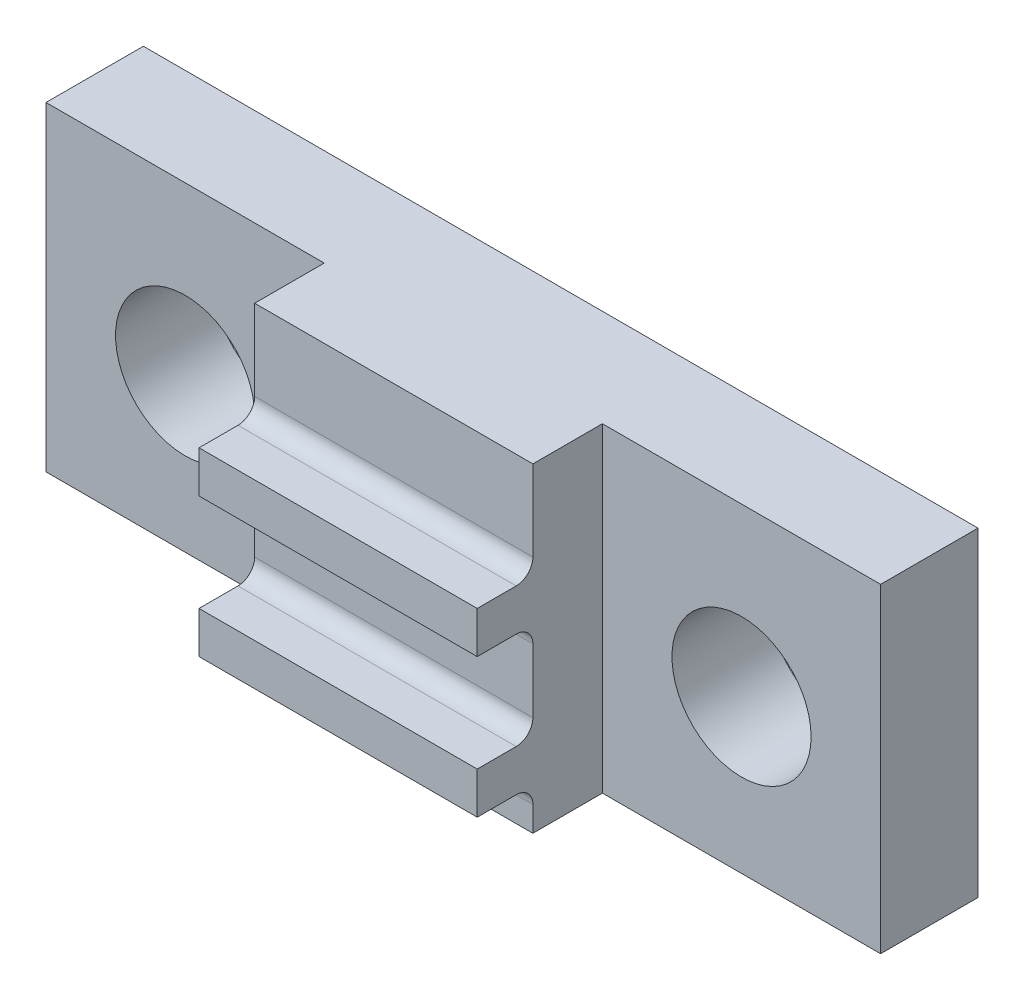
ISO-10303-21;
HEADER;
FILE_DESCRIPTION(('STEP AP214'),'2;1');
FILE_NAME('part.step','',(''),(''),'','','');
FILE_SCHEMA(('AUTOMOTIVE_DESIGN { 1 0 10303 214 1 1 1 1 }'));
ENDSEC;
DATA;
#1=APPLICATION_CONTEXT('core data for automotive mechanical design processes');
#2=APPLICATION_PROTOCOL_DEFINITION('international standard','automotive_design',2000,#1);
#3=PRODUCT_CONTEXT('',#1,'mechanical');
#4=PRODUCT('Part','Part','',(#3));
#5=PRODUCT_RELATED_PRODUCT_CATEGORY('part','',(#4));
#6=PRODUCT_DEFINITION_FORMATION('','',#4);
#7=PRODUCT_DEFINITION_CONTEXT('part definition',#1,'design');
#8=PRODUCT_DEFINITION('design','',#6,#7);
#9=PRODUCT_DEFINITION_SHAPE('','',#8);
#10=(LENGTH_UNIT() NAMED_UNIT(*) SI_UNIT(.MILLI.,.METRE.));
#11=(NAMED_UNIT(*) PLANE_ANGLE_UNIT() SI_UNIT($,.RADIAN.));
#12=(NAMED_UNIT(*) SI_UNIT($,.STERADIAN.) SOLID_ANGLE_UNIT());
#13=UNCERTAINTY_MEASURE_WITH_UNIT(LENGTH_MEASURE(1.E-05),#10,'distance_accuracy_value','');
#14=(GEOMETRIC_REPRESENTATION_CONTEXT(3) GLOBAL_UNCERTAINTY_ASSIGNED_CONTEXT((#13)) GLOBAL_UNIT_ASSIGNED_CONTEXT((#10,
#11,#12)) REPRESENTATION_CONTEXT('',''));
#15=CARTESIAN_POINT('',(0.,0.,0.));
#16=DIRECTION('',(0.,0.,1.));
#17=DIRECTION('',(1.,0.,0.));
#18=AXIS2_PLACEMENT_3D('',#15,#16,#17);
#19=CARTESIAN_POINT('',(0.,0.,8.));
#20=DIRECTION('',(0.,0.,1.));
#21=DIRECTION('',(1.,0.,0.));
#22=AXIS2_PLACEMENT_3D('',#19,#20,#21);
#23=PLANE('',#22);
#24=DIRECTION('',(-1.,0.,0.));
#25=VECTOR('',#24,1.);
#26=CARTESIAN_POINT('',(9.03112887414928,-4.25,8.));
#27=LINE('',#26,#25);
#28=CARTESIAN_POINT('',(5.,-4.25,8.));
#29=VERTEX_POINT('',#28);
#30=CARTESIAN_POINT('',(-5.,-4.25,8.));
#31=VERTEX_POINT('',#30);
#32=EDGE_CURVE('E174',#29,#31,#27,.T.);
#33=ORIENTED_EDGE('',*,*,#32,.F.);
#34=DIRECTION('',(0.,1.,0.));
#35=VECTOR('',#34,1.);
#36=CARTESIAN_POINT('',(5.,5.75,8.));
#37=LINE('',#36,#35);
#38=CARTESIAN_POINT('',(5.,-2.75,8.));
#39=VERTEX_POINT('',#38);
#40=EDGE_CURVE('E186',#29,#39,#37,.T.);
#41=ORIENTED_EDGE('',*,*,#40,.T.);
#42=DIRECTION('',(-1.,0.,0.));
#43=VECTOR('',#42,1.);
#44=CARTESIAN_POINT('',(9.03112887414928,-2.75,8.));
#45=LINE('',#44,#43);
#46=CARTESIAN_POINT('',(-5.,-2.75,8.));
#47=VERTEX_POINT('',#46);
#48=EDGE_CURVE('E274',#39,#47,#45,.T.);
#49=ORIENTED_EDGE('',*,*,#48,.T.);
#50=DIRECTION('',(0.,-1.,0.));
#51=VECTOR('',#50,1.);
#52=CARTESIAN_POINT('',(-5.,5.75,8.));
#53=LINE('',#52,#51);
#54=EDGE_CURVE('E189',#47,#31,#53,.T.);
#55=ORIENTED_EDGE('',*,*,#54,.T.);
#56=EDGE_LOOP('',(#33,#41,#49,#55));
#57=FACE_BOUND('',#56,.T.);
#58=ADVANCED_FACE('F35',(#57),#23,.T.);
#59=CARTESIAN_POINT('',(0.,0.,3.5));
#60=DIRECTION('',(0.,0.,1.));
#61=DIRECTION('',(1.,0.,0.));
#62=AXIS2_PLACEMENT_3D('',#59,#60,#61);
#63=PLANE('',#62);
#64=DIRECTION('',(0.,1.,0.));
#65=VECTOR('',#64,1.);
#66=CARTESIAN_POINT('',(5.,5.75,3.5));
#67=LINE('',#66,#65);
#68=CARTESIAN_POINT('',(5.,-5.75,3.5));
#69=VERTEX_POINT('',#68);
#70=CARTESIAN_POINT('',(5.,5.75,3.5));
#71=VERTEX_POINT('',#70);
#72=EDGE_CURVE('E213',#69,#71,#67,.T.);
#73=ORIENTED_EDGE('',*,*,#72,.F.);
#74=DIRECTION('',(1.,0.,0.));
#75=VECTOR('',#74,1.);
#76=CARTESIAN_POINT('',(-15.,-5.75,3.5));
#77=LINE('',#76,#75);
#78=CARTESIAN_POINT('',(15.,-5.75,3.5));
#79=VERTEX_POINT('',#78);
#80=EDGE_CURVE('E345',#69,#79,#77,.T.);
#81=ORIENTED_EDGE('',*,*,#80,.T.);
#82=DIRECTION('',(0.,1.,0.));
#83=VECTOR('',#82,1.);
#84=CARTESIAN_POINT('',(15.,5.75,3.5));
#85=LINE('',#84,#83);
#86=CARTESIAN_POINT('',(15.,5.75,3.5));
#87=VERTEX_POINT('',#86);
#88=EDGE_CURVE('E341',#79,#87,#85,.T.);
#89=ORIENTED_EDGE('',*,*,#88,.T.);
#90=DIRECTION('',(-1.,0.,0.));
#91=VECTOR('',#90,1.);
#92=CARTESIAN_POINT('',(-15.,5.75,3.5));
#93=LINE('',#92,#91);
#94=EDGE_CURVE('E331',#87,#71,#93,.T.);
#95=ORIENTED_EDGE('',*,*,#94,.T.);
#96=EDGE_LOOP('',(#73,#81,#89,#95));
#97=FACE_BOUND('',#96,.T.);
#98=CARTESIAN_POINT('',(10.,-0.250000000000001,3.5));
#99=DIRECTION('',(0.,0.,1.));
#100=DIRECTION('',(1.,0.,0.));
#101=AXIS2_PLACEMENT_3D('',#98,#99,#100);
#102=CIRCLE('',#101,2.5);
#103=CARTESIAN_POINT('',(12.5,-0.250000000000001,3.5));
#104=VERTEX_POINT('',#103);
#105=EDGE_CURVE('E397',#104,#104,#102,.T.);
#106=ORIENTED_EDGE('',*,*,#105,.F.);
#107=EDGE_LOOP('',(#106));
#108=FACE_BOUND('',#107,.T.);
#109=ADVANCED_FACE('F367',(#97,#108),#63,.T.);
#110=DIRECTION('',(0.,-1.,0.));
#111=VECTOR('',#110,1.);
#112=CARTESIAN_POINT('',(-5.,5.75,3.5));
#113=LINE('',#112,#111);
#114=CARTESIAN_POINT('',(-5.,5.75,3.5));
#115=VERTEX_POINT('',#114);
#116=CARTESIAN_POINT('',(-5.,-5.75,3.5));
#117=VERTEX_POINT('',#116);
#118=EDGE_CURVE('E201',#115,#117,#113,.T.);
#119=ORIENTED_EDGE('',*,*,#118,.F.);
#120=CARTESIAN_POINT('',(-15.,5.75,3.5));
#121=VERTEX_POINT('',#120);
#122=EDGE_CURVE('E336',#115,#121,#93,.T.);
#123=ORIENTED_EDGE('',*,*,#122,.T.);
#124=DIRECTION('',(0.,-1.,0.));
#125=VECTOR('',#124,1.);
#126=CARTESIAN_POINT('',(-15.,5.75,3.5));
#127=LINE('',#126,#125);
#128=CARTESIAN_POINT('',(-15.,-5.75,3.5));
#129=VERTEX_POINT('',#128);
#130=EDGE_CURVE('E335',#121,#129,#127,.T.);
#131=ORIENTED_EDGE('',*,*,#130,.T.);
#132=EDGE_CURVE('E353',#129,#117,#77,.T.);
#133=ORIENTED_EDGE('',*,*,#132,.T.);
#134=EDGE_LOOP('',(#119,#123,#131,#133));
#135=FACE_BOUND('',#134,.T.);
#136=CARTESIAN_POINT('',(-10.,-0.25,3.5));
#137=DIRECTION('',(0.,0.,1.));
#138=DIRECTION('',(1.,0.,0.));
#139=AXIS2_PLACEMENT_3D('',#136,#137,#138);
#140=CIRCLE('',#139,2.5);
#141=CARTESIAN_POINT('',(-7.5,-0.25,3.5));
#142=VERTEX_POINT('',#141);
#143=EDGE_CURVE('E390',#142,#142,#140,.T.);
#144=ORIENTED_EDGE('',*,*,#143,.F.);
#145=EDGE_LOOP('',(#144));
#146=FACE_BOUND('',#145,.T.);
#147=ADVANCED_FACE('F407',(#135,#146),#63,.T.);
#148=CARTESIAN_POINT('',(0.,0.,0.));
#149=DIRECTION('',(0.,0.,1.));
#150=DIRECTION('',(1.,0.,0.));
#151=AXIS2_PLACEMENT_3D('',#148,#149,#150);
#152=PLANE('',#151);
#153=CARTESIAN_POINT('',(-10.,-0.25,0.));
#154=DIRECTION('',(0.,0.,1.));
#155=DIRECTION('',(1.,0.,0.));
#156=AXIS2_PLACEMENT_3D('',#153,#154,#155);
#157=CIRCLE('',#156,2.5);
#158=CARTESIAN_POINT('',(-7.5,-0.25,0.));
#159=VERTEX_POINT('',#158);
#160=EDGE_CURVE('E392',#159,#159,#157,.T.);
#161=ORIENTED_EDGE('',*,*,#160,.T.);
#162=EDGE_LOOP('',(#161));
#163=FACE_BOUND('',#162,.T.);
#164=DIRECTION('',(0.,1.,0.));
#165=VECTOR('',#164,1.);
#166=CARTESIAN_POINT('',(15.,5.75,0.));
#167=LINE('',#166,#165);
#168=CARTESIAN_POINT('',(15.,-5.75,0.));
#169=VERTEX_POINT('',#168);
#170=CARTESIAN_POINT('',(15.,5.75,0.));
#171=VERTEX_POINT('',#170);
#172=EDGE_CURVE('E348',#169,#171,#167,.T.);
#173=ORIENTED_EDGE('',*,*,#172,.F.);
#174=DIRECTION('',(1.,0.,0.));
#175=VECTOR('',#174,1.);
#176=CARTESIAN_POINT('',(-15.,-5.75,0.));
#177=LINE('',#176,#175);
#178=CARTESIAN_POINT('',(-15.,-5.75,0.));
#179=VERTEX_POINT('',#178);
#180=EDGE_CURVE('E375',#179,#169,#177,.T.);
#181=ORIENTED_EDGE('',*,*,#180,.F.);
#182=DIRECTION('',(0.,-1.,0.));
#183=VECTOR('',#182,1.);
#184=CARTESIAN_POINT('',(-15.,5.75,0.));
#185=LINE('',#184,#183);
#186=CARTESIAN_POINT('',(-15.,5.75,0.));
#187=VERTEX_POINT('',#186);
#188=EDGE_CURVE('E379',#187,#179,#185,.T.);
#189=ORIENTED_EDGE('',*,*,#188,.F.);
#190=DIRECTION('',(-1.,0.,0.));
#191=VECTOR('',#190,1.);
#192=CARTESIAN_POINT('',(-15.,5.75,0.));
#193=LINE('',#192,#191);
#194=EDGE_CURVE('E381',#171,#187,#193,.T.);
#195=ORIENTED_EDGE('',*,*,#194,.F.);
#196=EDGE_LOOP('',(#173,#181,#189,#195));
#197=FACE_BOUND('',#196,.T.);
#198=CARTESIAN_POINT('',(10.,-0.250000000000001,0.));
#199=DIRECTION('',(0.,0.,1.));
#200=DIRECTION('',(1.,0.,0.));
#201=AXIS2_PLACEMENT_3D('',#198,#199,#200);
#202=CIRCLE('',#201,2.5);
#203=CARTESIAN_POINT('',(12.5,-0.250000000000001,0.));
#204=VERTEX_POINT('',#203);
#205=EDGE_CURVE('E399',#204,#204,#202,.T.);
#206=ORIENTED_EDGE('',*,*,#205,.T.);
#207=EDGE_LOOP('',(#206));
#208=FACE_BOUND('',#207,.T.);
#209=ADVANCED_FACE('F388',(#163,#197,#208),#152,.F.);
#210=CARTESIAN_POINT('',(15.,5.75,3.5));
#211=DIRECTION('',(-1.,0.,0.));
#212=DIRECTION('',(0.,-1.,0.));
#213=AXIS2_PLACEMENT_3D('',#210,#211,#212);
#214=PLANE('',#213);
#215=ORIENTED_EDGE('',*,*,#172,.T.);
#216=DIRECTION('',(0.,0.,-1.));
#217=VECTOR('',#216,1.);
#218=CARTESIAN_POINT('',(15.,5.75,3.5));
#219=LINE('',#218,#217);
#220=EDGE_CURVE('E319',#87,#171,#219,.T.);
#221=ORIENTED_EDGE('',*,*,#220,.F.);
#222=ORIENTED_EDGE('',*,*,#88,.F.);
#223=DIRECTION('',(0.,0.,-1.));
#224=VECTOR('',#223,1.);
#225=CARTESIAN_POINT('',(15.,-5.75,3.5));
#226=LINE('',#225,#224);
#227=EDGE_CURVE('E355',#79,#169,#226,.T.);
#228=ORIENTED_EDGE('',*,*,#227,.T.);
#229=EDGE_LOOP('',(#215,#221,#222,#228));
#230=FACE_BOUND('',#229,.T.);
#231=ADVANCED_FACE('F378',(#230),#214,.F.);
#232=CARTESIAN_POINT('',(-15.,5.75,3.5));
#233=DIRECTION('',(0.,-1.,0.));
#234=DIRECTION('',(0.,0.,-1.));
#235=AXIS2_PLACEMENT_3D('',#232,#233,#234);
#236=PLANE('',#235);
#237=DIRECTION('',(0.,0.,-1.));
#238=VECTOR('',#237,1.);
#239=CARTESIAN_POINT('',(-5.,5.75,8.));
#240=LINE('',#239,#238);
#241=CARTESIAN_POINT('',(-5.,5.75,6.));
#242=VERTEX_POINT('',#241);
#243=EDGE_CURVE('E617',#242,#115,#240,.T.);
#244=ORIENTED_EDGE('',*,*,#243,.F.);
#245=DIRECTION('',(-1.,0.,0.));
#246=VECTOR('',#245,1.);
#247=CARTESIAN_POINT('',(15.000025,5.75,6.));
#248=LINE('',#247,#246);
#249=CARTESIAN_POINT('',(5.,5.75,6.));
#250=VERTEX_POINT('',#249);
#251=EDGE_CURVE('E304',#250,#242,#248,.T.);
#252=ORIENTED_EDGE('',*,*,#251,.F.);
#253=DIRECTION('',(0.,0.,-1.));
#254=VECTOR('',#253,1.);
#255=CARTESIAN_POINT('',(5.,5.75,8.));
#256=LINE('',#255,#254);
#257=EDGE_CURVE('E309',#250,#71,#256,.T.);
#258=ORIENTED_EDGE('',*,*,#257,.T.);
#259=ORIENTED_EDGE('',*,*,#94,.F.);
#260=ORIENTED_EDGE('',*,*,#220,.T.);
#261=ORIENTED_EDGE('',*,*,#194,.T.);
#262=DIRECTION('',(0.,0.,-1.));
#263=VECTOR('',#262,1.);
#264=CARTESIAN_POINT('',(-15.,5.75,3.5));
#265=LINE('',#264,#263);
#266=EDGE_CURVE('E321',#121,#187,#265,.T.);
#267=ORIENTED_EDGE('',*,*,#266,.F.);
#268=ORIENTED_EDGE('',*,*,#122,.F.);
#269=EDGE_LOOP('',(#244,#252,#258,#259,#260,#261,#267,#268));
#270=FACE_BOUND('',#269,.T.);
#271=ADVANCED_FACE('F426',(#270),#236,.F.);
#272=CARTESIAN_POINT('',(-15.,5.75,3.5));
#273=DIRECTION('',(1.,0.,0.));
#274=DIRECTION('',(0.,1.,0.));
#275=AXIS2_PLACEMENT_3D('',#272,#273,#274);
#276=PLANE('',#275);
#277=ORIENTED_EDGE('',*,*,#188,.T.);
#278=DIRECTION('',(0.,0.,-1.));
#279=VECTOR('',#278,1.);
#280=CARTESIAN_POINT('',(-15.,-5.75,3.5));
#281=LINE('',#280,#279);
#282=EDGE_CURVE('E327',#129,#179,#281,.T.);
#283=ORIENTED_EDGE('',*,*,#282,.F.);
#284=ORIENTED_EDGE('',*,*,#130,.F.);
#285=ORIENTED_EDGE('',*,*,#266,.T.);
#286=EDGE_LOOP('',(#277,#283,#284,#285));
#287=FACE_BOUND('',#286,.T.);
#288=ADVANCED_FACE('F423',(#287),#276,.F.);
#289=CARTESIAN_POINT('',(-15.,-5.75,3.5));
#290=DIRECTION('',(0.,1.,0.));
#291=DIRECTION('',(0.,0.,1.));
#292=AXIS2_PLACEMENT_3D('',#289,#290,#291);
#293=PLANE('',#292);
#294=DIRECTION('',(0.,0.,-1.));
#295=VECTOR('',#294,1.);
#296=CARTESIAN_POINT('',(5.,-5.75,8.));
#297=LINE('',#296,#295);
#298=CARTESIAN_POINT('',(5.,-5.75,6.));
#299=VERTEX_POINT('',#298);
#300=EDGE_CURVE('E207',#299,#69,#297,.T.);
#301=ORIENTED_EDGE('',*,*,#300,.F.);
#302=DIRECTION('',(-1.,0.,0.));
#303=VECTOR('',#302,1.);
#304=CARTESIAN_POINT('',(-15.,-5.75,6.));
#305=LINE('',#304,#303);
#306=CARTESIAN_POINT('',(-5.,-5.75,6.));
#307=VERTEX_POINT('',#306);
#308=EDGE_CURVE('E288',#299,#307,#305,.T.);
#309=ORIENTED_EDGE('',*,*,#308,.T.);
#310=DIRECTION('',(0.,0.,-1.));
#311=VECTOR('',#310,1.);
#312=CARTESIAN_POINT('',(-5.,-5.75,8.));
#313=LINE('',#312,#311);
#314=EDGE_CURVE('E226',#307,#117,#313,.T.);
#315=ORIENTED_EDGE('',*,*,#314,.T.);
#316=ORIENTED_EDGE('',*,*,#132,.F.);
#317=ORIENTED_EDGE('',*,*,#282,.T.);
#318=ORIENTED_EDGE('',*,*,#180,.T.);
#319=ORIENTED_EDGE('',*,*,#227,.F.);
#320=ORIENTED_EDGE('',*,*,#80,.F.);
#321=EDGE_LOOP('',(#301,#309,#315,#316,#317,#318,#319,#320));
#322=FACE_BOUND('',#321,.T.);
#323=ADVANCED_FACE('F372',(#322),#293,.F.);
#324=CARTESIAN_POINT('',(-10.,-0.25,3.5));
#325=DIRECTION('',(0.,0.,-1.));
#326=DIRECTION('',(-1.,0.,0.));
#327=AXIS2_PLACEMENT_3D('',#324,#325,#326);
#328=CYLINDRICAL_SURFACE('',#327,2.5);
#329=ORIENTED_EDGE('',*,*,#143,.T.);
#330=EDGE_LOOP('',(#329));
#331=FACE_BOUND('',#330,.T.);
#332=ORIENTED_EDGE('',*,*,#160,.F.);
#333=EDGE_LOOP('',(#332));
#334=FACE_BOUND('',#333,.T.);
#335=ADVANCED_FACE('F416',(#331,#334),#328,.F.);
#336=CARTESIAN_POINT('',(10.,-0.250000000000001,3.5));
#337=DIRECTION('',(0.,0.,-1.));
#338=DIRECTION('',(-1.,0.,0.));
#339=AXIS2_PLACEMENT_3D('',#336,#337,#338);
#340=CYLINDRICAL_SURFACE('',#339,2.5);
#341=ORIENTED_EDGE('',*,*,#105,.T.);
#342=EDGE_LOOP('',(#341));
#343=FACE_BOUND('',#342,.T.);
#344=ORIENTED_EDGE('',*,*,#205,.F.);
#345=EDGE_LOOP('',(#344));
#346=FACE_BOUND('',#345,.T.);
#347=ADVANCED_FACE('F404',(#343,#346),#340,.F.);
#348=CARTESIAN_POINT('',(5.,5.75,8.));
#349=DIRECTION('',(-1.,0.,0.));
#350=DIRECTION('',(0.,0.,1.));
#351=AXIS2_PLACEMENT_3D('',#348,#349,#350);
#352=PLANE('',#351);
#353=DIRECTION('',(0.,0.,1.));
#354=VECTOR('',#353,1.);
#355=CARTESIAN_POINT('',(5.,-4.25,6.));
#356=LINE('',#355,#354);
#357=CARTESIAN_POINT('',(5.,-4.25,6.6));
#358=VERTEX_POINT('',#357);
#359=EDGE_CURVE('E170',#358,#29,#356,.T.);
#360=ORIENTED_EDGE('',*,*,#359,.F.);
#361=CARTESIAN_POINT('',(5.,-4.85,6.6));
#362=DIRECTION('',(-1.,0.,0.));
#363=DIRECTION('',(0.,0.,1.));
#364=AXIS2_PLACEMENT_3D('',#361,#362,#363);
#365=CIRCLE('',#364,0.6);
#366=CARTESIAN_POINT('',(5.,-4.85,6.));
#367=VERTEX_POINT('',#366);
#368=EDGE_CURVE('E249',#358,#367,#365,.T.);
#369=ORIENTED_EDGE('',*,*,#368,.T.);
#370=DIRECTION('',(0.,1.,0.));
#371=VECTOR('',#370,1.);
#372=CARTESIAN_POINT('',(5.,-4.25,6.));
#373=LINE('',#372,#371);
#374=EDGE_CURVE('E181',#299,#367,#373,.T.);
#375=ORIENTED_EDGE('',*,*,#374,.F.);
#376=ORIENTED_EDGE('',*,*,#300,.T.);
#377=ORIENTED_EDGE('',*,*,#72,.T.);
#378=ORIENTED_EDGE('',*,*,#257,.F.);
#379=DIRECTION('',(0.,-1.,0.));
#380=VECTOR('',#379,1.);
#381=CARTESIAN_POINT('',(5.,5.75,6.));
#382=LINE('',#381,#380);
#383=CARTESIAN_POINT('',(5.,2.85,6.));
#384=VERTEX_POINT('',#383);
#385=EDGE_CURVE('E203',#250,#384,#382,.T.);
#386=ORIENTED_EDGE('',*,*,#385,.T.);
#387=CARTESIAN_POINT('',(5.,2.85,6.6));
#388=DIRECTION('',(-1.,0.,0.));
#389=DIRECTION('',(0.,0.,1.));
#390=AXIS2_PLACEMENT_3D('',#387,#388,#389);
#391=CIRCLE('',#390,0.6);
#392=CARTESIAN_POINT('',(5.,2.25,6.6));
#393=VERTEX_POINT('',#392);
#394=EDGE_CURVE('E11',#384,#393,#391,.T.);
#395=ORIENTED_EDGE('',*,*,#394,.T.);
#396=DIRECTION('',(0.,0.,1.));
#397=VECTOR('',#396,1.);
#398=CARTESIAN_POINT('',(5.,2.25,8.));
#399=LINE('',#398,#397);
#400=CARTESIAN_POINT('',(5.,2.25,8.));
#401=VERTEX_POINT('',#400);
#402=EDGE_CURVE('E305',#393,#401,#399,.T.);
#403=ORIENTED_EDGE('',*,*,#402,.T.);
#404=CARTESIAN_POINT('',(5.,0.75,8.));
#405=VERTEX_POINT('',#404);
#406=EDGE_CURVE('E196',#405,#401,#37,.T.);
#407=ORIENTED_EDGE('',*,*,#406,.F.);
#408=DIRECTION('',(0.,0.,1.));
#409=VECTOR('',#408,1.);
#410=CARTESIAN_POINT('',(5.,0.75,6.));
#411=LINE('',#410,#409);
#412=CARTESIAN_POINT('',(5.,0.75,6.6));
#413=VERTEX_POINT('',#412);
#414=EDGE_CURVE('E265',#413,#405,#411,.T.);
#415=ORIENTED_EDGE('',*,*,#414,.F.);
#416=CARTESIAN_POINT('',(5.,0.15,6.6));
#417=DIRECTION('',(-1.,0.,0.));
#418=DIRECTION('',(0.,0.,1.));
#419=AXIS2_PLACEMENT_3D('',#416,#417,#418);
#420=CIRCLE('',#419,0.6);
#421=CARTESIAN_POINT('',(5.,0.15,6.));
#422=VERTEX_POINT('',#421);
#423=EDGE_CURVE('E257',#413,#422,#420,.T.);
#424=ORIENTED_EDGE('',*,*,#423,.T.);
#425=DIRECTION('',(0.,1.,0.));
#426=VECTOR('',#425,1.);
#427=CARTESIAN_POINT('',(5.,0.75,6.));
#428=LINE('',#427,#426);
#429=CARTESIAN_POINT('',(5.,-2.15,6.));
#430=VERTEX_POINT('',#429);
#431=EDGE_CURVE('E262',#430,#422,#428,.T.);
#432=ORIENTED_EDGE('',*,*,#431,.F.);
#433=CARTESIAN_POINT('',(5.,-2.15,6.6));
#434=DIRECTION('',(-1.,0.,0.));
#435=DIRECTION('',(0.,0.,1.));
#436=AXIS2_PLACEMENT_3D('',#433,#434,#435);
#437=CIRCLE('',#436,0.6);
#438=CARTESIAN_POINT('',(5.,-2.75,6.6));
#439=VERTEX_POINT('',#438);
#440=EDGE_CURVE('E253',#430,#439,#437,.T.);
#441=ORIENTED_EDGE('',*,*,#440,.T.);
#442=DIRECTION('',(0.,0.,-1.));
#443=VECTOR('',#442,1.);
#444=CARTESIAN_POINT('',(5.,-2.75,6.));
#445=LINE('',#444,#443);
#446=EDGE_CURVE('E195',#39,#439,#445,.T.);
#447=ORIENTED_EDGE('',*,*,#446,.F.);
#448=ORIENTED_EDGE('',*,*,#40,.F.);
#449=EDGE_LOOP('',(#360,#369,#375,#376,#377,#378,#386,#395,#403,#407,#415,#424,#432,#441,#447,#448));
#450=FACE_BOUND('',#449,.T.);
#451=ADVANCED_FACE('F193',(#450),#352,.F.);
#452=CARTESIAN_POINT('',(-5.,5.75,8.));
#453=DIRECTION('',(1.,0.,0.));
#454=DIRECTION('',(0.,0.,-1.));
#455=AXIS2_PLACEMENT_3D('',#452,#453,#454);
#456=PLANE('',#455);
#457=ORIENTED_EDGE('',*,*,#314,.F.);
#458=DIRECTION('',(0.,-1.,0.));
#459=VECTOR('',#458,1.);
#460=CARTESIAN_POINT('',(-5.,-4.25,6.));
#461=LINE('',#460,#459);
#462=CARTESIAN_POINT('',(-5.,-4.85,6.));
#463=VERTEX_POINT('',#462);
#464=EDGE_CURVE('E190',#463,#307,#461,.T.);
#465=ORIENTED_EDGE('',*,*,#464,.F.);
#466=CARTESIAN_POINT('',(-5.,-4.85,6.6));
#467=DIRECTION('',(1.,0.,0.));
#468=DIRECTION('',(0.,0.,-1.));
#469=AXIS2_PLACEMENT_3D('',#466,#467,#468);
#470=CIRCLE('',#469,0.6);
#471=CARTESIAN_POINT('',(-5.,-4.25,6.6));
#472=VERTEX_POINT('',#471);
#473=EDGE_CURVE('E247',#463,#472,#470,.T.);
#474=ORIENTED_EDGE('',*,*,#473,.T.);
#475=DIRECTION('',(0.,0.,-1.));
#476=VECTOR('',#475,1.);
#477=CARTESIAN_POINT('',(-5.,-4.25,6.));
#478=LINE('',#477,#476);
#479=EDGE_CURVE('E629',#31,#472,#478,.T.);
#480=ORIENTED_EDGE('',*,*,#479,.F.);
#481=ORIENTED_EDGE('',*,*,#54,.F.);
#482=DIRECTION('',(0.,0.,1.));
#483=VECTOR('',#482,1.);
#484=CARTESIAN_POINT('',(-5.,-2.75,6.));
#485=LINE('',#484,#483);
#486=CARTESIAN_POINT('',(-5.,-2.75,6.6));
#487=VERTEX_POINT('',#486);
#488=EDGE_CURVE('E290',#487,#47,#485,.T.);
#489=ORIENTED_EDGE('',*,*,#488,.F.);
#490=CARTESIAN_POINT('',(-5.,-2.15,6.6));
#491=DIRECTION('',(1.,0.,0.));
#492=DIRECTION('',(0.,0.,-1.));
#493=AXIS2_PLACEMENT_3D('',#490,#491,#492);
#494=CIRCLE('',#493,0.6);
#495=CARTESIAN_POINT('',(-5.,-2.15,6.));
#496=VERTEX_POINT('',#495);
#497=EDGE_CURVE('E251',#487,#496,#494,.T.);
#498=ORIENTED_EDGE('',*,*,#497,.T.);
#499=DIRECTION('',(0.,-1.,0.));
#500=VECTOR('',#499,1.);
#501=CARTESIAN_POINT('',(-5.,0.75,6.));
#502=LINE('',#501,#500);
#503=CARTESIAN_POINT('',(-5.,0.15,6.));
#504=VERTEX_POINT('',#503);
#505=EDGE_CURVE('E283',#504,#496,#502,.T.);
#506=ORIENTED_EDGE('',*,*,#505,.F.);
#507=CARTESIAN_POINT('',(-5.,0.15,6.6));
#508=DIRECTION('',(1.,0.,0.));
#509=DIRECTION('',(0.,0.,-1.));
#510=AXIS2_PLACEMENT_3D('',#507,#508,#509);
#511=CIRCLE('',#510,0.6);
#512=CARTESIAN_POINT('',(-5.,0.75,6.6));
#513=VERTEX_POINT('',#512);
#514=EDGE_CURVE('E255',#504,#513,#511,.T.);
#515=ORIENTED_EDGE('',*,*,#514,.T.);
#516=DIRECTION('',(0.,0.,-1.));
#517=VECTOR('',#516,1.);
#518=CARTESIAN_POINT('',(-5.,0.75,6.));
#519=LINE('',#518,#517);
#520=CARTESIAN_POINT('',(-5.,0.75,8.));
#521=VERTEX_POINT('',#520);
#522=EDGE_CURVE('E282',#521,#513,#519,.T.);
#523=ORIENTED_EDGE('',*,*,#522,.F.);
#524=CARTESIAN_POINT('',(-5.,2.25,8.));
#525=VERTEX_POINT('',#524);
#526=EDGE_CURVE('E198',#525,#521,#53,.T.);
#527=ORIENTED_EDGE('',*,*,#526,.F.);
#528=DIRECTION('',(0.,0.,1.));
#529=VECTOR('',#528,1.);
#530=CARTESIAN_POINT('',(-5.,2.25,6.));
#531=LINE('',#530,#529);
#532=CARTESIAN_POINT('',(-5.,2.25,6.6));
#533=VERTEX_POINT('',#532);
#534=EDGE_CURVE('E302',#533,#525,#531,.T.);
#535=ORIENTED_EDGE('',*,*,#534,.F.);
#536=CARTESIAN_POINT('',(-5.,2.85,6.6));
#537=DIRECTION('',(1.,0.,0.));
#538=DIRECTION('',(0.,0.,-1.));
#539=AXIS2_PLACEMENT_3D('',#536,#537,#538);
#540=CIRCLE('',#539,0.6);
#541=CARTESIAN_POINT('',(-5.,2.85,6.));
#542=VERTEX_POINT('',#541);
#543=EDGE_CURVE('E43',#533,#542,#540,.T.);
#544=ORIENTED_EDGE('',*,*,#543,.T.);
#545=DIRECTION('',(0.,-1.,0.));
#546=VECTOR('',#545,1.);
#547=CARTESIAN_POINT('',(-5.,5.75,6.));
#548=LINE('',#547,#546);
#549=EDGE_CURVE('E300',#242,#542,#548,.T.);
#550=ORIENTED_EDGE('',*,*,#549,.F.);
#551=ORIENTED_EDGE('',*,*,#243,.T.);
#552=ORIENTED_EDGE('',*,*,#118,.T.);
#553=EDGE_LOOP('',(#457,#465,#474,#480,#481,#489,#498,#506,#515,#523,#527,#535,#544,#550,#551,#552));
#554=FACE_BOUND('',#553,.T.);
#555=ADVANCED_FACE('F280',(#554),#456,.F.);
#556=DIRECTION('',(-1.,0.,0.));
#557=VECTOR('',#556,1.);
#558=CARTESIAN_POINT('',(9.03112887414928,0.75,8.));
#559=LINE('',#558,#557);
#560=EDGE_CURVE('E287',#405,#521,#559,.T.);
#561=ORIENTED_EDGE('',*,*,#560,.F.);
#562=ORIENTED_EDGE('',*,*,#406,.T.);
#563=DIRECTION('',(1.,0.,0.));
#564=VECTOR('',#563,1.);
#565=CARTESIAN_POINT('',(0.,2.25,8.));
#566=LINE('',#565,#564);
#567=EDGE_CURVE('E221',#525,#401,#566,.T.);
#568=ORIENTED_EDGE('',*,*,#567,.F.);
#569=ORIENTED_EDGE('',*,*,#526,.T.);
#570=EDGE_LOOP('',(#561,#562,#568,#569));
#571=FACE_BOUND('',#570,.T.);
#572=ADVANCED_FACE('F318',(#571),#23,.T.);
#573=CARTESIAN_POINT('',(15.000025,5.75,6.));
#574=DIRECTION('',(0.,0.,-1.));
#575=DIRECTION('',(0.,1.,0.));
#576=AXIS2_PLACEMENT_3D('',#573,#574,#575);
#577=PLANE('',#576);
#578=ORIENTED_EDGE('',*,*,#549,.T.);
#579=DIRECTION('',(-1.,0.,0.));
#580=VECTOR('',#579,1.);
#581=CARTESIAN_POINT('',(5.,2.85,6.));
#582=LINE('',#581,#580);
#583=EDGE_CURVE('E50',#542,#384,#582,.F.);
#584=ORIENTED_EDGE('',*,*,#583,.T.);
#585=ORIENTED_EDGE('',*,*,#385,.F.);
#586=ORIENTED_EDGE('',*,*,#251,.T.);
#587=EDGE_LOOP('',(#578,#584,#585,#586));
#588=FACE_BOUND('',#587,.T.);
#589=ADVANCED_FACE('F514',(#588),#577,.F.);
#590=CARTESIAN_POINT('',(15.000025,2.25,6.));
#591=DIRECTION('',(0.,-1.,0.));
#592=DIRECTION('',(0.,0.,-1.));
#593=AXIS2_PLACEMENT_3D('',#590,#591,#592);
#594=PLANE('',#593);
#595=ORIENTED_EDGE('',*,*,#402,.F.);
#596=DIRECTION('',(-1.,0.,0.));
#597=VECTOR('',#596,1.);
#598=CARTESIAN_POINT('',(-5.,2.25,6.6));
#599=LINE('',#598,#597);
#600=EDGE_CURVE('E243',#393,#533,#599,.T.);
#601=ORIENTED_EDGE('',*,*,#600,.T.);
#602=ORIENTED_EDGE('',*,*,#534,.T.);
#603=ORIENTED_EDGE('',*,*,#567,.T.);
#604=EDGE_LOOP('',(#595,#601,#602,#603));
#605=FACE_BOUND('',#604,.T.);
#606=ADVANCED_FACE('F314',(#605),#594,.F.);
#607=CARTESIAN_POINT('',(9.03112887414928,-2.75,6.));
#608=DIRECTION('',(0.,-1.,0.));
#609=DIRECTION('',(0.,0.,-1.));
#610=AXIS2_PLACEMENT_3D('',#607,#608,#609);
#611=PLANE('',#610);
#612=ORIENTED_EDGE('',*,*,#446,.T.);
#613=DIRECTION('',(-1.,0.,0.));
#614=VECTOR('',#613,1.);
#615=CARTESIAN_POINT('',(-5.,-2.75,6.6));
#616=LINE('',#615,#614);
#617=EDGE_CURVE('E233',#439,#487,#616,.T.);
#618=ORIENTED_EDGE('',*,*,#617,.T.);
#619=ORIENTED_EDGE('',*,*,#488,.T.);
#620=ORIENTED_EDGE('',*,*,#48,.F.);
#621=EDGE_LOOP('',(#612,#618,#619,#620));
#622=FACE_BOUND('',#621,.T.);
#623=ADVANCED_FACE('F495',(#622),#611,.F.);
#624=CARTESIAN_POINT('',(9.03112887414928,0.75,6.));
#625=DIRECTION('',(0.,0.,-1.));
#626=DIRECTION('',(-1.,0.,0.));
#627=AXIS2_PLACEMENT_3D('',#624,#625,#626);
#628=PLANE('',#627);
#629=ORIENTED_EDGE('',*,*,#505,.T.);
#630=DIRECTION('',(-1.,0.,0.));
#631=VECTOR('',#630,1.);
#632=CARTESIAN_POINT('',(5.,-2.15,6.));
#633=LINE('',#632,#631);
#634=EDGE_CURVE('E239',#496,#430,#633,.F.);
#635=ORIENTED_EDGE('',*,*,#634,.T.);
#636=ORIENTED_EDGE('',*,*,#431,.T.);
#637=DIRECTION('',(-1.,0.,0.));
#638=VECTOR('',#637,1.);
#639=CARTESIAN_POINT('',(-5.,0.15,6.));
#640=LINE('',#639,#638);
#641=EDGE_CURVE('E236',#422,#504,#640,.T.);
#642=ORIENTED_EDGE('',*,*,#641,.T.);
#643=EDGE_LOOP('',(#629,#635,#636,#642));
#644=FACE_BOUND('',#643,.T.);
#645=ADVANCED_FACE('F271',(#644),#628,.F.);
#646=CARTESIAN_POINT('',(9.03112887414928,0.75,6.));
#647=DIRECTION('',(0.,1.,0.));
#648=DIRECTION('',(0.,0.,1.));
#649=AXIS2_PLACEMENT_3D('',#646,#647,#648);
#650=PLANE('',#649);
#651=ORIENTED_EDGE('',*,*,#522,.T.);
#652=DIRECTION('',(-1.,0.,0.));
#653=VECTOR('',#652,1.);
#654=CARTESIAN_POINT('',(5.,0.75,6.6));
#655=LINE('',#654,#653);
#656=EDGE_CURVE('E241',#513,#413,#655,.F.);
#657=ORIENTED_EDGE('',*,*,#656,.T.);
#658=ORIENTED_EDGE('',*,*,#414,.T.);
#659=ORIENTED_EDGE('',*,*,#560,.T.);
#660=EDGE_LOOP('',(#651,#657,#658,#659));
#661=FACE_BOUND('',#660,.T.);
#662=ADVANCED_FACE('F285',(#661),#650,.F.);
#663=CARTESIAN_POINT('',(9.03112887414928,-4.25,6.));
#664=DIRECTION('',(0.,0.,-1.));
#665=DIRECTION('',(-1.,0.,0.));
#666=AXIS2_PLACEMENT_3D('',#663,#664,#665);
#667=PLANE('',#666);
#668=ORIENTED_EDGE('',*,*,#374,.T.);
#669=DIRECTION('',(-1.,0.,0.));
#670=VECTOR('',#669,1.);
#671=CARTESIAN_POINT('',(-5.,-4.85,6.));
#672=LINE('',#671,#670);
#673=EDGE_CURVE('E229',#367,#463,#672,.T.);
#674=ORIENTED_EDGE('',*,*,#673,.T.);
#675=ORIENTED_EDGE('',*,*,#464,.T.);
#676=ORIENTED_EDGE('',*,*,#308,.F.);
#677=EDGE_LOOP('',(#668,#674,#675,#676));
#678=FACE_BOUND('',#677,.T.);
#679=ADVANCED_FACE('F469',(#678),#667,.F.);
#680=CARTESIAN_POINT('',(9.03112887414928,-4.25,6.));
#681=DIRECTION('',(0.,1.,0.));
#682=DIRECTION('',(0.,0.,1.));
#683=AXIS2_PLACEMENT_3D('',#680,#681,#682);
#684=PLANE('',#683);
#685=ORIENTED_EDGE('',*,*,#479,.T.);
#686=DIRECTION('',(-1.,0.,0.));
#687=VECTOR('',#686,1.);
#688=CARTESIAN_POINT('',(5.,-4.25,6.6));
#689=LINE('',#688,#687);
#690=EDGE_CURVE('E177',#472,#358,#689,.F.);
#691=ORIENTED_EDGE('',*,*,#690,.T.);
#692=ORIENTED_EDGE('',*,*,#359,.T.);
#693=ORIENTED_EDGE('',*,*,#32,.T.);
#694=EDGE_LOOP('',(#685,#691,#692,#693));
#695=FACE_BOUND('',#694,.T.);
#696=ADVANCED_FACE('F173',(#695),#684,.F.);
#697=CARTESIAN_POINT('',(9.03112887414928,-4.85,6.6));
#698=DIRECTION('',(1.,0.,0.));
#699=DIRECTION('',(0.,0.,-1.));
#700=AXIS2_PLACEMENT_3D('',#697,#698,#699);
#701=CYLINDRICAL_SURFACE('',#700,0.6);
#702=ORIENTED_EDGE('',*,*,#368,.F.);
#703=ORIENTED_EDGE('',*,*,#690,.F.);
#704=ORIENTED_EDGE('',*,*,#473,.F.);
#705=ORIENTED_EDGE('',*,*,#673,.F.);
#706=EDGE_LOOP('',(#702,#703,#704,#705));
#707=FACE_BOUND('',#706,.T.);
#708=ADVANCED_FACE('F431',(#707),#701,.F.);
#709=CARTESIAN_POINT('',(9.03112887414928,-2.15,6.6));
#710=DIRECTION('',(1.,0.,0.));
#711=DIRECTION('',(0.,0.,-1.));
#712=AXIS2_PLACEMENT_3D('',#709,#710,#711);
#713=CYLINDRICAL_SURFACE('',#712,0.6);
#714=ORIENTED_EDGE('',*,*,#440,.F.);
#715=ORIENTED_EDGE('',*,*,#634,.F.);
#716=ORIENTED_EDGE('',*,*,#497,.F.);
#717=ORIENTED_EDGE('',*,*,#617,.F.);
#718=EDGE_LOOP('',(#714,#715,#716,#717));
#719=FACE_BOUND('',#718,.T.);
#720=ADVANCED_FACE('F434',(#719),#713,.F.);
#721=CARTESIAN_POINT('',(9.03112887414928,0.15,6.6));
#722=DIRECTION('',(1.,0.,0.));
#723=DIRECTION('',(0.,0.,-1.));
#724=AXIS2_PLACEMENT_3D('',#721,#722,#723);
#725=CYLINDRICAL_SURFACE('',#724,0.6);
#726=ORIENTED_EDGE('',*,*,#423,.F.);
#727=ORIENTED_EDGE('',*,*,#656,.F.);
#728=ORIENTED_EDGE('',*,*,#514,.F.);
#729=ORIENTED_EDGE('',*,*,#641,.F.);
#730=EDGE_LOOP('',(#726,#727,#728,#729));
#731=FACE_BOUND('',#730,.T.);
#732=ADVANCED_FACE('F276',(#731),#725,.F.);
#733=CARTESIAN_POINT('',(15.000025,2.85,6.6));
#734=DIRECTION('',(1.,0.,0.));
#735=DIRECTION('',(0.,0.,-1.));
#736=AXIS2_PLACEMENT_3D('',#733,#734,#735);
#737=CYLINDRICAL_SURFACE('',#736,0.6);
#738=ORIENTED_EDGE('',*,*,#394,.F.);
#739=ORIENTED_EDGE('',*,*,#583,.F.);
#740=ORIENTED_EDGE('',*,*,#543,.F.);
#741=ORIENTED_EDGE('',*,*,#600,.F.);
#742=EDGE_LOOP('',(#738,#739,#740,#741));
#743=FACE_BOUND('',#742,.T.);
#744=ADVANCED_FACE('F37',(#743),#737,.F.);
#745=CLOSED_SHELL('',(#58,#109,#147,#209,#231,#271,#288,#323,#335,#347,#451,#555,#572,#589,#606,
#623,#645,#662,#679,#696,#708,#720,#732,#744));
#746=MANIFOLD_SOLID_BREP('B2',#745);
#747=ADVANCED_BREP_SHAPE_REPRESENTATION('',(#18,#746),#14);
#748=SHAPE_DEFINITION_REPRESENTATION(#9,#747);
ENDSEC;
END-ISO-10303-21;
